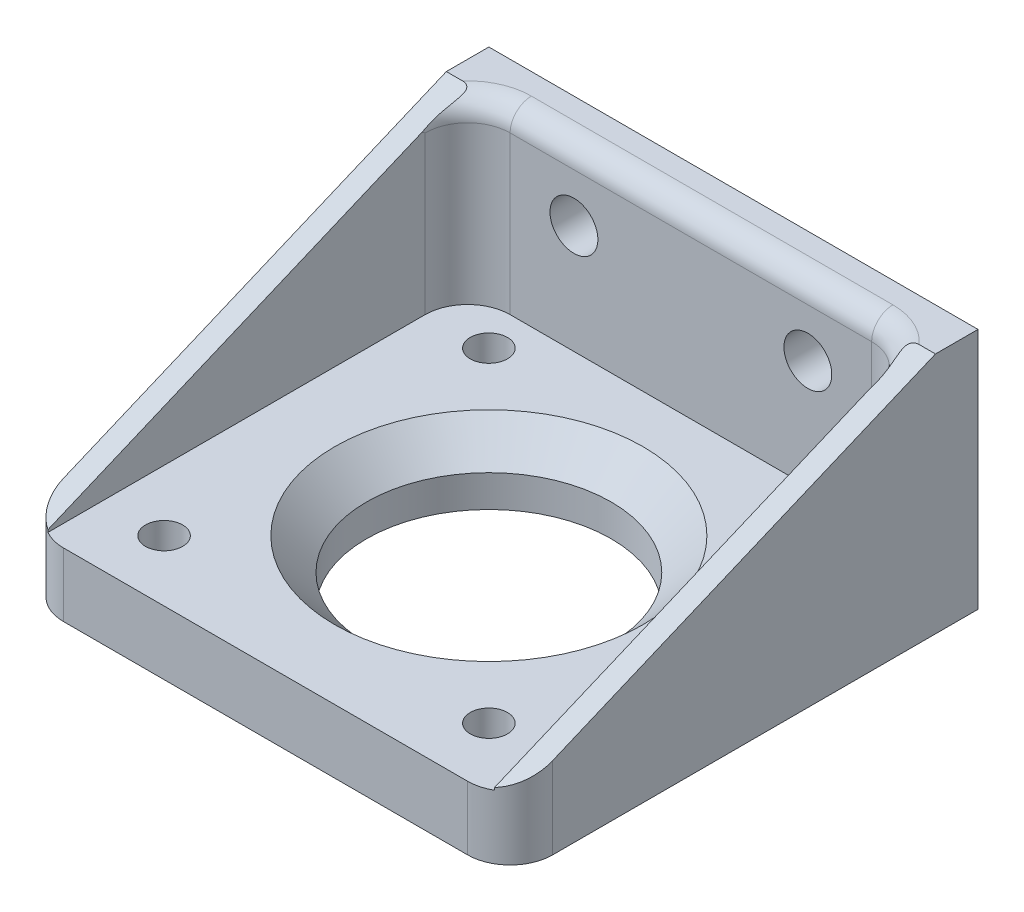
ISO-10303-21;
HEADER;
FILE_DESCRIPTION(('STEP AP214'),'2;1');
FILE_NAME('part.step','',(''),(''),'','','');
FILE_SCHEMA(('AUTOMOTIVE_DESIGN { 1 0 10303 214 1 1 1 1 }'));
ENDSEC;
DATA;
#1=APPLICATION_CONTEXT('core data for automotive mechanical design processes');
#2=APPLICATION_PROTOCOL_DEFINITION('international standard','automotive_design',2000,#1);
#3=PRODUCT_CONTEXT('',#1,'mechanical');
#4=PRODUCT('Part','Part','',(#3));
#5=PRODUCT_RELATED_PRODUCT_CATEGORY('part','',(#4));
#6=PRODUCT_DEFINITION_FORMATION('','',#4);
#7=PRODUCT_DEFINITION_CONTEXT('part definition',#1,'design');
#8=PRODUCT_DEFINITION('design','',#6,#7);
#9=PRODUCT_DEFINITION_SHAPE('','',#8);
#10=(LENGTH_UNIT() NAMED_UNIT(*) SI_UNIT(.MILLI.,.METRE.));
#11=(NAMED_UNIT(*) PLANE_ANGLE_UNIT() SI_UNIT($,.RADIAN.));
#12=(NAMED_UNIT(*) SI_UNIT($,.STERADIAN.) SOLID_ANGLE_UNIT());
#13=UNCERTAINTY_MEASURE_WITH_UNIT(LENGTH_MEASURE(1.E-05),#10,'distance_accuracy_value','');
#14=(GEOMETRIC_REPRESENTATION_CONTEXT(3) GLOBAL_UNCERTAINTY_ASSIGNED_CONTEXT((#13)) GLOBAL_UNIT_ASSIGNED_CONTEXT((#10,
#11,#12)) REPRESENTATION_CONTEXT('',''));
#15=CARTESIAN_POINT('',(0.,0.,0.));
#16=DIRECTION('',(0.,0.,1.));
#17=DIRECTION('',(1.,0.,0.));
#18=AXIS2_PLACEMENT_3D('',#15,#16,#17);
#19=CARTESIAN_POINT('',(0.,3.,0.));
#20=DIRECTION('',(0.,-1.,0.));
#21=DIRECTION('',(0.,0.,-1.));
#22=AXIS2_PLACEMENT_3D('',#19,#20,#21);
#23=PLANE('',#22);
#24=CARTESIAN_POINT('',(-2.,3.,3.64000000000001));
#25=DIRECTION('',(0.,-1.,0.));
#26=DIRECTION('',(0.,0.,-1.));
#27=AXIS2_PLACEMENT_3D('',#24,#25,#26);
#28=CIRCLE('',#27,14.5);
#29=CARTESIAN_POINT('',(-2.,3.,-10.86));
#30=VERTEX_POINT('',#29);
#31=EDGE_CURVE('E11',#30,#30,#28,.T.);
#32=ORIENTED_EDGE('',*,*,#31,.T.);
#33=EDGE_LOOP('',(#32));
#34=FACE_BOUND('',#33,.T.);
#35=CARTESIAN_POINT('',(13.2735064736295,3.,18.9135064736298));
#36=DIRECTION('',(0.,-1.,0.));
#37=DIRECTION('',(0.,0.,-1.));
#38=AXIS2_PLACEMENT_3D('',#35,#36,#37);
#39=CIRCLE('',#38,1.75);
#40=CARTESIAN_POINT('',(13.2735064736295,3.,17.1635064736298));
#41=VERTEX_POINT('',#40);
#42=EDGE_CURVE('E385',#41,#41,#39,.T.);
#43=ORIENTED_EDGE('',*,*,#42,.T.);
#44=EDGE_LOOP('',(#43));
#45=FACE_BOUND('',#44,.T.);
#46=CARTESIAN_POINT('',(13.2735064736297,3.,-11.6335064736291));
#47=DIRECTION('',(0.,-1.,0.));
#48=DIRECTION('',(0.,0.,-1.));
#49=AXIS2_PLACEMENT_3D('',#46,#47,#48);
#50=CIRCLE('',#49,1.75);
#51=CARTESIAN_POINT('',(13.2735064736297,3.,-13.3835064736291));
#52=VERTEX_POINT('',#51);
#53=EDGE_CURVE('E719',#52,#52,#50,.T.);
#54=ORIENTED_EDGE('',*,*,#53,.T.);
#55=EDGE_LOOP('',(#54));
#56=FACE_BOUND('',#55,.T.);
#57=CARTESIAN_POINT('',(-17.2735064736292,3.,-11.6335064736292));
#58=DIRECTION('',(0.,-1.,0.));
#59=DIRECTION('',(0.,0.,-1.));
#60=AXIS2_PLACEMENT_3D('',#57,#58,#59);
#61=CIRCLE('',#60,1.75);
#62=CARTESIAN_POINT('',(-17.2735064736292,3.,-13.3835064736292));
#63=VERTEX_POINT('',#62);
#64=EDGE_CURVE('E717',#63,#63,#61,.T.);
#65=ORIENTED_EDGE('',*,*,#64,.T.);
#66=EDGE_LOOP('',(#65));
#67=FACE_BOUND('',#66,.T.);
#68=CARTESIAN_POINT('',(-17.2735064736294,3.,18.9135064736295));
#69=DIRECTION('',(0.,-1.,0.));
#70=DIRECTION('',(0.,0.,-1.));
#71=AXIS2_PLACEMENT_3D('',#68,#69,#70);
#72=CIRCLE('',#71,1.75);
#73=CARTESIAN_POINT('',(-17.2735064736294,3.,17.1635064736295));
#74=VERTEX_POINT('',#73);
#75=EDGE_CURVE('E714',#74,#74,#72,.T.);
#76=ORIENTED_EDGE('',*,*,#75,.T.);
#77=EDGE_LOOP('',(#76));
#78=FACE_BOUND('',#77,.T.);
#79=DIRECTION('',(0.,0.,1.));
#80=VECTOR('',#79,1.);
#81=CARTESIAN_POINT('',(19.,3.,24.64));
#82=LINE('',#81,#80);
#83=CARTESIAN_POINT('',(19.,3.,-11.36));
#84=VERTEX_POINT('',#83);
#85=CARTESIAN_POINT('',(19.,3.,24.1041016151378));
#86=VERTEX_POINT('',#85);
#87=EDGE_CURVE('E373',#84,#86,#82,.T.);
#88=ORIENTED_EDGE('',*,*,#87,.F.);
#89=CARTESIAN_POINT('',(15.,3.,-11.36));
#90=DIRECTION('',(0.,-1.,0.));
#91=DIRECTION('',(0.,0.,-1.));
#92=AXIS2_PLACEMENT_3D('',#89,#90,#91);
#93=CIRCLE('',#92,4.);
#94=CARTESIAN_POINT('',(15.,3.,-15.36));
#95=VERTEX_POINT('',#94);
#96=EDGE_CURVE('E226',#84,#95,#93,.F.);
#97=ORIENTED_EDGE('',*,*,#96,.T.);
#98=DIRECTION('',(1.,0.,0.));
#99=VECTOR('',#98,1.);
#100=CARTESIAN_POINT('',(-25.,3.,-15.36));
#101=LINE('',#100,#99);
#102=CARTESIAN_POINT('',(-19.,3.,-15.36));
#103=VERTEX_POINT('',#102);
#104=EDGE_CURVE('E187',#103,#95,#101,.T.);
#105=ORIENTED_EDGE('',*,*,#104,.F.);
#106=CARTESIAN_POINT('',(-19.,3.,-11.36));
#107=DIRECTION('',(0.,-1.,0.));
#108=DIRECTION('',(0.,0.,-1.));
#109=AXIS2_PLACEMENT_3D('',#106,#107,#108);
#110=CIRCLE('',#109,4.);
#111=CARTESIAN_POINT('',(-23.,3.,-11.36));
#112=VERTEX_POINT('',#111);
#113=EDGE_CURVE('E224',#103,#112,#110,.F.);
#114=ORIENTED_EDGE('',*,*,#113,.T.);
#115=DIRECTION('',(0.,0.,1.));
#116=VECTOR('',#115,1.);
#117=CARTESIAN_POINT('',(-23.,3.,-15.36));
#118=LINE('',#117,#116);
#119=CARTESIAN_POINT('',(-23.,3.,24.1041016151378));
#120=VERTEX_POINT('',#119);
#121=EDGE_CURVE('E190',#112,#120,#118,.T.);
#122=ORIENTED_EDGE('',*,*,#121,.T.);
#123=CARTESIAN_POINT('',(-21.,3.,20.64));
#124=DIRECTION('',(0.,-1.,0.));
#125=DIRECTION('',(0.,0.,-1.));
#126=AXIS2_PLACEMENT_3D('',#123,#124,#125);
#127=CIRCLE('',#126,4.);
#128=CARTESIAN_POINT('',(-21.,3.,24.64));
#129=VERTEX_POINT('',#128);
#130=EDGE_CURVE('E220',#120,#129,#127,.F.);
#131=ORIENTED_EDGE('',*,*,#130,.T.);
#132=DIRECTION('',(1.,0.,0.));
#133=VECTOR('',#132,1.);
#134=CARTESIAN_POINT('',(-25.,3.,24.64));
#135=LINE('',#134,#133);
#136=CARTESIAN_POINT('',(17.,3.,24.64));
#137=VERTEX_POINT('',#136);
#138=EDGE_CURVE('E200',#129,#137,#135,.T.);
#139=ORIENTED_EDGE('',*,*,#138,.T.);
#140=CARTESIAN_POINT('',(17.,3.,20.64));
#141=DIRECTION('',(0.,-1.,0.));
#142=DIRECTION('',(0.,0.,-1.));
#143=AXIS2_PLACEMENT_3D('',#140,#141,#142);
#144=CIRCLE('',#143,4.);
#145=EDGE_CURVE('E222',#137,#86,#144,.F.);
#146=ORIENTED_EDGE('',*,*,#145,.T.);
#147=EDGE_LOOP('',(#88,#97,#105,#114,#122,#131,#139,#146));
#148=FACE_BOUND('',#147,.T.);
#149=ADVANCED_FACE('F41',(#34,#45,#56,#67,#78,#148),#23,.F.);
#150=CARTESIAN_POINT('',(-25.,19.8,-15.36));
#151=DIRECTION('',(0.,0.,-1.));
#152=DIRECTION('',(-1.,0.,0.));
#153=AXIS2_PLACEMENT_3D('',#150,#151,#152);
#154=PLANE('',#153);
#155=CARTESIAN_POINT('',(9.,13.2389047699533,-15.36));
#156=DIRECTION('',(0.,0.,-1.));
#157=DIRECTION('',(-1.,0.,0.));
#158=AXIS2_PLACEMENT_3D('',#155,#156,#157);
#159=CIRCLE('',#158,2.25);
#160=CARTESIAN_POINT('',(6.75,13.2389047699533,-15.36));
#161=VERTEX_POINT('',#160);
#162=EDGE_CURVE('E695',#161,#161,#159,.T.);
#163=ORIENTED_EDGE('',*,*,#162,.T.);
#164=EDGE_LOOP('',(#163));
#165=FACE_BOUND('',#164,.T.);
#166=CARTESIAN_POINT('',(-13.,13.2389047699533,-15.36));
#167=DIRECTION('',(0.,0.,-1.));
#168=DIRECTION('',(-1.,0.,0.));
#169=AXIS2_PLACEMENT_3D('',#166,#167,#168);
#170=CIRCLE('',#169,2.25);
#171=CARTESIAN_POINT('',(-15.25,13.2389047699533,-15.36));
#172=VERTEX_POINT('',#171);
#173=EDGE_CURVE('E697',#172,#172,#170,.T.);
#174=ORIENTED_EDGE('',*,*,#173,.T.);
#175=EDGE_LOOP('',(#174));
#176=FACE_BOUND('',#175,.T.);
#177=DIRECTION('',(0.,-1.,0.));
#178=VECTOR('',#177,1.);
#179=CARTESIAN_POINT('',(15.,19.8,-15.36));
#180=LINE('',#179,#178);
#181=CARTESIAN_POINT('',(15.,17.8,-15.36));
#182=VERTEX_POINT('',#181);
#183=EDGE_CURVE('E230',#95,#182,#180,.F.);
#184=ORIENTED_EDGE('',*,*,#183,.T.);
#185=DIRECTION('',(1.,0.,0.));
#186=VECTOR('',#185,1.);
#187=CARTESIAN_POINT('',(-19.,17.8,-15.36));
#188=LINE('',#187,#186);
#189=CARTESIAN_POINT('',(-19.,17.8,-15.36));
#190=VERTEX_POINT('',#189);
#191=EDGE_CURVE('E414',#182,#190,#188,.F.);
#192=ORIENTED_EDGE('',*,*,#191,.T.);
#193=DIRECTION('',(0.,-1.,0.));
#194=VECTOR('',#193,1.);
#195=CARTESIAN_POINT('',(-19.,3.,-15.36));
#196=LINE('',#195,#194);
#197=EDGE_CURVE('E228',#190,#103,#196,.T.);
#198=ORIENTED_EDGE('',*,*,#197,.T.);
#199=ORIENTED_EDGE('',*,*,#104,.T.);
#200=EDGE_LOOP('',(#184,#192,#198,#199));
#201=FACE_BOUND('',#200,.T.);
#202=ADVANCED_FACE('F322',(#165,#176,#201),#154,.F.);
#203=CARTESIAN_POINT('',(0.,-3.,0.));
#204=DIRECTION('',(0.,-1.,0.));
#205=DIRECTION('',(0.,0.,-1.));
#206=AXIS2_PLACEMENT_3D('',#203,#204,#205);
#207=PLANE('',#206);
#208=CARTESIAN_POINT('',(13.2735064736295,-3.,18.9135064736298));
#209=DIRECTION('',(0.,-1.,0.));
#210=DIRECTION('',(0.,0.,-1.));
#211=AXIS2_PLACEMENT_3D('',#208,#209,#210);
#212=CIRCLE('',#211,1.75);
#213=CARTESIAN_POINT('',(13.2735064736295,-3.,17.1635064736298));
#214=VERTEX_POINT('',#213);
#215=EDGE_CURVE('E696',#214,#214,#212,.T.);
#216=ORIENTED_EDGE('',*,*,#215,.F.);
#217=EDGE_LOOP('',(#216));
#218=FACE_BOUND('',#217,.T.);
#219=CARTESIAN_POINT('',(13.2735064736297,-3.,-11.6335064736291));
#220=DIRECTION('',(0.,-1.,0.));
#221=DIRECTION('',(0.,0.,-1.));
#222=AXIS2_PLACEMENT_3D('',#219,#220,#221);
#223=CIRCLE('',#222,1.75);
#224=CARTESIAN_POINT('',(13.2735064736297,-3.,-13.3835064736291));
#225=VERTEX_POINT('',#224);
#226=EDGE_CURVE('E700',#225,#225,#223,.T.);
#227=ORIENTED_EDGE('',*,*,#226,.F.);
#228=EDGE_LOOP('',(#227));
#229=FACE_BOUND('',#228,.T.);
#230=CARTESIAN_POINT('',(-17.2735064736292,-3.,-11.6335064736292));
#231=DIRECTION('',(0.,-1.,0.));
#232=DIRECTION('',(0.,0.,-1.));
#233=AXIS2_PLACEMENT_3D('',#230,#231,#232);
#234=CIRCLE('',#233,1.75);
#235=CARTESIAN_POINT('',(-17.2735064736292,-3.,-13.3835064736292));
#236=VERTEX_POINT('',#235);
#237=EDGE_CURVE('E706',#236,#236,#234,.T.);
#238=ORIENTED_EDGE('',*,*,#237,.F.);
#239=EDGE_LOOP('',(#238));
#240=FACE_BOUND('',#239,.T.);
#241=CARTESIAN_POINT('',(-17.2735064736294,-3.,18.9135064736295));
#242=DIRECTION('',(0.,-1.,0.));
#243=DIRECTION('',(0.,0.,-1.));
#244=AXIS2_PLACEMENT_3D('',#241,#242,#243);
#245=CIRCLE('',#244,1.75);
#246=CARTESIAN_POINT('',(-17.2735064736294,-3.,17.1635064736295));
#247=VERTEX_POINT('',#246);
#248=EDGE_CURVE('E709',#247,#247,#245,.T.);
#249=ORIENTED_EDGE('',*,*,#248,.F.);
#250=EDGE_LOOP('',(#249));
#251=FACE_BOUND('',#250,.T.);
#252=DIRECTION('',(0.,0.,-1.));
#253=VECTOR('',#252,1.);
#254=CARTESIAN_POINT('',(21.,-3.,24.64));
#255=LINE('',#254,#253);
#256=CARTESIAN_POINT('',(21.,-3.,20.64));
#257=VERTEX_POINT('',#256);
#258=CARTESIAN_POINT('',(21.,-3.,-19.36));
#259=VERTEX_POINT('',#258);
#260=EDGE_CURVE('E199',#257,#259,#255,.T.);
#261=ORIENTED_EDGE('',*,*,#260,.F.);
#262=CARTESIAN_POINT('',(17.,-3.,20.64));
#263=DIRECTION('',(0.,-1.,0.));
#264=DIRECTION('',(0.,0.,-1.));
#265=AXIS2_PLACEMENT_3D('',#262,#263,#264);
#266=CIRCLE('',#265,4.);
#267=CARTESIAN_POINT('',(17.,-3.,24.64));
#268=VERTEX_POINT('',#267);
#269=EDGE_CURVE('E242',#257,#268,#266,.T.);
#270=ORIENTED_EDGE('',*,*,#269,.T.);
#271=DIRECTION('',(1.,0.,0.));
#272=VECTOR('',#271,1.);
#273=CARTESIAN_POINT('',(-25.,-3.,24.64));
#274=LINE('',#273,#272);
#275=CARTESIAN_POINT('',(-21.,-3.,24.64));
#276=VERTEX_POINT('',#275);
#277=EDGE_CURVE('E204',#276,#268,#274,.T.);
#278=ORIENTED_EDGE('',*,*,#277,.F.);
#279=CARTESIAN_POINT('',(-21.,-3.,20.64));
#280=DIRECTION('',(0.,-1.,0.));
#281=DIRECTION('',(0.,0.,-1.));
#282=AXIS2_PLACEMENT_3D('',#279,#280,#281);
#283=CIRCLE('',#282,4.);
#284=CARTESIAN_POINT('',(-25.,-3.,20.64));
#285=VERTEX_POINT('',#284);
#286=EDGE_CURVE('E240',#276,#285,#283,.T.);
#287=ORIENTED_EDGE('',*,*,#286,.T.);
#288=DIRECTION('',(0.,0.,1.));
#289=VECTOR('',#288,1.);
#290=CARTESIAN_POINT('',(-25.,-3.,24.64));
#291=LINE('',#290,#289);
#292=CARTESIAN_POINT('',(-25.,-3.,-19.36));
#293=VERTEX_POINT('',#292);
#294=EDGE_CURVE('E208',#293,#285,#291,.T.);
#295=ORIENTED_EDGE('',*,*,#294,.F.);
#296=DIRECTION('',(-1.,0.,0.));
#297=VECTOR('',#296,1.);
#298=CARTESIAN_POINT('',(-25.,-3.,-19.36));
#299=LINE('',#298,#297);
#300=EDGE_CURVE('E206',#259,#293,#299,.T.);
#301=ORIENTED_EDGE('',*,*,#300,.F.);
#302=EDGE_LOOP('',(#261,#270,#278,#287,#295,#301));
#303=FACE_BOUND('',#302,.T.);
#304=CARTESIAN_POINT('',(-2.,-3.,3.64000000000001));
#305=DIRECTION('',(0.,1.,0.));
#306=DIRECTION('',(0.,0.,1.));
#307=AXIS2_PLACEMENT_3D('',#304,#305,#306);
#308=CIRCLE('',#307,11.5);
#309=CARTESIAN_POINT('',(-2.,-3.,15.14));
#310=VERTEX_POINT('',#309);
#311=EDGE_CURVE('E195',#310,#310,#308,.T.);
#312=ORIENTED_EDGE('',*,*,#311,.T.);
#313=EDGE_LOOP('',(#312));
#314=FACE_BOUND('',#313,.T.);
#315=ADVANCED_FACE('F328',(#218,#229,#240,#251,#303,#314),#207,.T.);
#316=CARTESIAN_POINT('',(21.,3.,24.64));
#317=DIRECTION('',(-1.,0.,0.));
#318=DIRECTION('',(0.,0.,1.));
#319=AXIS2_PLACEMENT_3D('',#316,#317,#318);
#320=PLANE('',#319);
#321=DIRECTION('',(0.,0.387232484355092,-0.921982105607361));
#322=VECTOR('',#321,1.);
#323=CARTESIAN_POINT('',(21.,3.,24.64));
#324=LINE('',#323,#322);
#325=CARTESIAN_POINT('',(21.,4.68,20.64));
#326=VERTEX_POINT('',#325);
#327=CARTESIAN_POINT('',(21.,19.8,-15.36));
#328=VERTEX_POINT('',#327);
#329=EDGE_CURVE('E381',#326,#328,#324,.T.);
#330=ORIENTED_EDGE('',*,*,#329,.F.);
#331=DIRECTION('',(0.,-1.,0.));
#332=VECTOR('',#331,1.);
#333=CARTESIAN_POINT('',(21.,3.,20.64));
#334=LINE('',#333,#332);
#335=EDGE_CURVE('E237',#326,#257,#334,.T.);
#336=ORIENTED_EDGE('',*,*,#335,.T.);
#337=ORIENTED_EDGE('',*,*,#260,.T.);
#338=DIRECTION('',(0.,-1.,0.));
#339=VECTOR('',#338,1.);
#340=CARTESIAN_POINT('',(21.,3.,-19.36));
#341=LINE('',#340,#339);
#342=CARTESIAN_POINT('',(21.,19.8,-19.36));
#343=VERTEX_POINT('',#342);
#344=EDGE_CURVE('E213',#343,#259,#341,.T.);
#345=ORIENTED_EDGE('',*,*,#344,.F.);
#346=DIRECTION('',(0.,0.,-1.));
#347=VECTOR('',#346,1.);
#348=CARTESIAN_POINT('',(21.,19.8,-19.36));
#349=LINE('',#348,#347);
#350=EDGE_CURVE('E180',#328,#343,#349,.T.);
#351=ORIENTED_EDGE('',*,*,#350,.F.);
#352=EDGE_LOOP('',(#330,#336,#337,#345,#351));
#353=FACE_BOUND('',#352,.T.);
#354=ADVANCED_FACE('F337',(#353),#320,.F.);
#355=CARTESIAN_POINT('',(-25.,3.,-19.36));
#356=DIRECTION('',(0.,0.,1.));
#357=DIRECTION('',(1.,0.,0.));
#358=AXIS2_PLACEMENT_3D('',#355,#356,#357);
#359=PLANE('',#358);
#360=CARTESIAN_POINT('',(9.,13.2389047699533,-19.36));
#361=DIRECTION('',(0.,0.,-1.));
#362=DIRECTION('',(-1.,0.,0.));
#363=AXIS2_PLACEMENT_3D('',#360,#361,#362);
#364=CIRCLE('',#363,2.25);
#365=CARTESIAN_POINT('',(6.75,13.2389047699533,-19.36));
#366=VERTEX_POINT('',#365);
#367=EDGE_CURVE('E692',#366,#366,#364,.T.);
#368=ORIENTED_EDGE('',*,*,#367,.F.);
#369=EDGE_LOOP('',(#368));
#370=FACE_BOUND('',#369,.T.);
#371=CARTESIAN_POINT('',(-13.,13.2389047699533,-19.36));
#372=DIRECTION('',(0.,0.,-1.));
#373=DIRECTION('',(-1.,0.,0.));
#374=AXIS2_PLACEMENT_3D('',#371,#372,#373);
#375=CIRCLE('',#374,2.25);
#376=CARTESIAN_POINT('',(-15.25,13.2389047699533,-19.36));
#377=VERTEX_POINT('',#376);
#378=EDGE_CURVE('E422',#377,#377,#375,.T.);
#379=ORIENTED_EDGE('',*,*,#378,.F.);
#380=EDGE_LOOP('',(#379));
#381=FACE_BOUND('',#380,.T.);
#382=ORIENTED_EDGE('',*,*,#300,.T.);
#383=DIRECTION('',(0.,-1.,0.));
#384=VECTOR('',#383,1.);
#385=CARTESIAN_POINT('',(-25.,3.,-19.36));
#386=LINE('',#385,#384);
#387=CARTESIAN_POINT('',(-25.,19.8,-19.36));
#388=VERTEX_POINT('',#387);
#389=EDGE_CURVE('E203',#388,#293,#386,.T.);
#390=ORIENTED_EDGE('',*,*,#389,.F.);
#391=DIRECTION('',(-1.,0.,0.));
#392=VECTOR('',#391,1.);
#393=CARTESIAN_POINT('',(-25.,19.8,-19.36));
#394=LINE('',#393,#392);
#395=EDGE_CURVE('E186',#343,#388,#394,.T.);
#396=ORIENTED_EDGE('',*,*,#395,.F.);
#397=ORIENTED_EDGE('',*,*,#344,.T.);
#398=EDGE_LOOP('',(#382,#390,#396,#397));
#399=FACE_BOUND('',#398,.T.);
#400=ADVANCED_FACE('F345',(#370,#381,#399),#359,.F.);
#401=CARTESIAN_POINT('',(-25.,3.,24.64));
#402=DIRECTION('',(1.,0.,0.));
#403=DIRECTION('',(0.,0.,-1.));
#404=AXIS2_PLACEMENT_3D('',#401,#402,#403);
#405=PLANE('',#404);
#406=ORIENTED_EDGE('',*,*,#294,.T.);
#407=DIRECTION('',(0.,-1.,0.));
#408=VECTOR('',#407,1.);
#409=CARTESIAN_POINT('',(-25.,3.,20.64));
#410=LINE('',#409,#408);
#411=CARTESIAN_POINT('',(-25.,4.68,20.64));
#412=VERTEX_POINT('',#411);
#413=EDGE_CURVE('E166',#285,#412,#410,.F.);
#414=ORIENTED_EDGE('',*,*,#413,.T.);
#415=DIRECTION('',(0.,0.387232484355092,-0.921982105607361));
#416=VECTOR('',#415,1.);
#417=CARTESIAN_POINT('',(-25.,3.,24.64));
#418=LINE('',#417,#416);
#419=CARTESIAN_POINT('',(-25.,19.8,-15.36));
#420=VERTEX_POINT('',#419);
#421=EDGE_CURVE('E158',#412,#420,#418,.T.);
#422=ORIENTED_EDGE('',*,*,#421,.T.);
#423=DIRECTION('',(0.,0.,1.));
#424=VECTOR('',#423,1.);
#425=CARTESIAN_POINT('',(-25.,19.8,-19.36));
#426=LINE('',#425,#424);
#427=EDGE_CURVE('E164',#388,#420,#426,.T.);
#428=ORIENTED_EDGE('',*,*,#427,.F.);
#429=ORIENTED_EDGE('',*,*,#389,.T.);
#430=EDGE_LOOP('',(#406,#414,#422,#428,#429));
#431=FACE_BOUND('',#430,.T.);
#432=ADVANCED_FACE('F161',(#431),#405,.F.);
#433=CARTESIAN_POINT('',(-25.,3.,24.64));
#434=DIRECTION('',(0.,0.,-1.));
#435=DIRECTION('',(-1.,0.,0.));
#436=AXIS2_PLACEMENT_3D('',#433,#434,#435);
#437=PLANE('',#436);
#438=ORIENTED_EDGE('',*,*,#277,.T.);
#439=DIRECTION('',(0.,-1.,0.));
#440=VECTOR('',#439,1.);
#441=CARTESIAN_POINT('',(17.,3.,24.64));
#442=LINE('',#441,#440);
#443=EDGE_CURVE('E247',#268,#137,#442,.F.);
#444=ORIENTED_EDGE('',*,*,#443,.T.);
#445=ORIENTED_EDGE('',*,*,#138,.F.);
#446=DIRECTION('',(0.,-1.,0.));
#447=VECTOR('',#446,1.);
#448=CARTESIAN_POINT('',(-21.,3.,24.64));
#449=LINE('',#448,#447);
#450=EDGE_CURVE('E244',#129,#276,#449,.T.);
#451=ORIENTED_EDGE('',*,*,#450,.T.);
#452=EDGE_LOOP('',(#438,#444,#445,#451));
#453=FACE_BOUND('',#452,.T.);
#454=ADVANCED_FACE('F339',(#453),#437,.F.);
#455=CARTESIAN_POINT('',(-2.,3.,3.64000000000001));
#456=DIRECTION('',(0.,-1.,0.));
#457=DIRECTION('',(0.,0.,-1.));
#458=AXIS2_PLACEMENT_3D('',#455,#456,#457);
#459=CYLINDRICAL_SURFACE('',#458,11.5);
#460=CARTESIAN_POINT('',(-2.,0.,3.64000000000001));
#461=DIRECTION('',(0.,-1.,0.));
#462=DIRECTION('',(0.,0.,-1.));
#463=AXIS2_PLACEMENT_3D('',#460,#461,#462);
#464=CIRCLE('',#463,11.5);
#465=CARTESIAN_POINT('',(-2.,0.,-7.85999999999999));
#466=VERTEX_POINT('',#465);
#467=EDGE_CURVE('E50',#466,#466,#464,.F.);
#468=ORIENTED_EDGE('',*,*,#467,.T.);
#469=EDGE_LOOP('',(#468));
#470=FACE_BOUND('',#469,.T.);
#471=ORIENTED_EDGE('',*,*,#311,.F.);
#472=EDGE_LOOP('',(#471));
#473=FACE_BOUND('',#472,.T.);
#474=ADVANCED_FACE('F334',(#470,#473),#459,.F.);
#475=CARTESIAN_POINT('',(0.,19.8,0.));
#476=DIRECTION('',(0.,1.,0.));
#477=DIRECTION('',(0.,0.,1.));
#478=AXIS2_PLACEMENT_3D('',#475,#476,#477);
#479=PLANE('',#478);
#480=DIRECTION('',(1.,0.,0.));
#481=VECTOR('',#480,1.);
#482=CARTESIAN_POINT('',(-25.,19.8,-15.36));
#483=LINE('',#482,#481);
#484=CARTESIAN_POINT('',(-23.4721359549996,19.8,-15.36));
#485=VERTEX_POINT('',#484);
#486=EDGE_CURVE('E173',#420,#485,#483,.T.);
#487=ORIENTED_EDGE('',*,*,#486,.T.);
#488=CARTESIAN_POINT('',(-19.,19.8,-11.36));
#489=DIRECTION('',(0.,1.,0.));
#490=DIRECTION('',(0.,0.,1.));
#491=AXIS2_PLACEMENT_3D('',#488,#489,#490);
#492=CIRCLE('',#491,6.);
#493=CARTESIAN_POINT('',(-19.,19.8,-17.36));
#494=VERTEX_POINT('',#493);
#495=EDGE_CURVE('E258',#485,#494,#492,.F.);
#496=ORIENTED_EDGE('',*,*,#495,.T.);
#497=DIRECTION('',(1.,0.,0.));
#498=VECTOR('',#497,1.);
#499=CARTESIAN_POINT('',(15.,19.8,-17.36));
#500=LINE('',#499,#498);
#501=CARTESIAN_POINT('',(15.,19.8,-17.36));
#502=VERTEX_POINT('',#501);
#503=EDGE_CURVE('E256',#494,#502,#500,.T.);
#504=ORIENTED_EDGE('',*,*,#503,.T.);
#505=CARTESIAN_POINT('',(15.,19.8,-11.36));
#506=DIRECTION('',(0.,1.,0.));
#507=DIRECTION('',(0.,0.,1.));
#508=AXIS2_PLACEMENT_3D('',#505,#506,#507);
#509=CIRCLE('',#508,6.);
#510=CARTESIAN_POINT('',(19.4721359549996,19.8,-15.36));
#511=VERTEX_POINT('',#510);
#512=EDGE_CURVE('E254',#502,#511,#509,.F.);
#513=ORIENTED_EDGE('',*,*,#512,.T.);
#514=DIRECTION('',(1.,0.,0.));
#515=VECTOR('',#514,1.);
#516=CARTESIAN_POINT('',(19.,19.8,-15.36));
#517=LINE('',#516,#515);
#518=EDGE_CURVE('E170',#511,#328,#517,.T.);
#519=ORIENTED_EDGE('',*,*,#518,.T.);
#520=ORIENTED_EDGE('',*,*,#350,.T.);
#521=ORIENTED_EDGE('',*,*,#395,.T.);
#522=ORIENTED_EDGE('',*,*,#427,.T.);
#523=EDGE_LOOP('',(#487,#496,#504,#513,#519,#520,#521,#522));
#524=FACE_BOUND('',#523,.T.);
#525=ADVANCED_FACE('F183',(#524),#479,.T.);
#526=CARTESIAN_POINT('',(-23.,3.,24.64));
#527=DIRECTION('',(0.,0.921982105607361,0.387232484355092));
#528=DIRECTION('',(0.,-0.387232484355092,0.921982105607361));
#529=AXIS2_PLACEMENT_3D('',#526,#527,#528);
#530=PLANE('',#529);
#531=DIRECTION('',(0.,0.387232484355092,-0.921982105607361));
#532=VECTOR('',#531,1.);
#533=CARTESIAN_POINT('',(-23.,3.,24.64));
#534=LINE('',#533,#532);
#535=CARTESIAN_POINT('',(-23.,3.22507732164214,24.1041016151378));
#536=VERTEX_POINT('',#535);
#537=CARTESIAN_POINT('',(-23.,18.0006150284118,-11.0757500676471));
#538=VERTEX_POINT('',#537);
#539=EDGE_CURVE('E169',#536,#538,#534,.T.);
#540=ORIENTED_EDGE('',*,*,#539,.T.);
#541=CARTESIAN_POINT('',(-23.,18.0006150284118,-11.0757500676471));
#542=CARTESIAN_POINT('',(-23.0126873197146,18.0475130252187,-11.1874119648065));
#543=CARTESIAN_POINT('',(-23.0223344588837,18.094529171564,-11.2993551703905));
#544=CARTESIAN_POINT('',(-23.0357862334119,18.1886707999268,-11.5235019045875));
#545=CARTESIAN_POINT('',(-23.0395929258982,18.2357962375896,-11.6357053275941));
#546=CARTESIAN_POINT('',(-23.0416047419086,18.3298046152374,-11.8595347981843));
#547=CARTESIAN_POINT('',(-23.0398404217505,18.3766874701925,-11.9711606433155));
#548=CARTESIAN_POINT('',(-23.0311206982482,18.4703822781451,-12.1942435193932));
#549=CARTESIAN_POINT('',(-23.0241649080875,18.5171942255989,-12.3057005371402));
#550=CARTESIAN_POINT('',(-23.0056875968255,18.6098372037759,-12.5262790566094));
#551=CARTESIAN_POINT('',(-22.9942500230372,18.6556707950437,-12.6354066548658));
#552=CARTESIAN_POINT('',(-22.9674028194854,18.7471639802359,-12.8532475719903));
#553=CARTESIAN_POINT('',(-22.9519928710062,18.7928235599006,-12.9619608569062));
#554=CARTESIAN_POINT('',(-22.9180230805476,18.8840053310033,-13.1790603119125));
#555=CARTESIAN_POINT('',(-22.8994604011387,18.9295273607511,-13.2874460970264));
#556=CARTESIAN_POINT('',(-22.8604125769851,19.0204457563549,-13.5039184675116));
#557=CARTESIAN_POINT('',(-22.8399273735832,19.0658421183331,-13.6120050436502));
#558=CARTESIAN_POINT('',(-22.8115260572747,19.1288950248425,-13.7621310115296));
#559=CARTESIAN_POINT('',(-22.8035793157853,19.1465497800507,-13.8041661429779));
#560=CARTESIAN_POINT('',(-22.7878813685466,19.1818695766775,-13.8882608968512));
#561=CARTESIAN_POINT('',(-22.7801301321017,19.1995346160301,-13.9303205143573));
#562=CARTESIAN_POINT('',(-22.7574349314295,19.2526359915066,-14.0567523607299));
#563=CARTESIAN_POINT('',(-22.7430816570046,19.2881105660202,-14.1412156333815));
#564=CARTESIAN_POINT('',(-22.7192871742502,19.3568387833111,-14.3048542459788));
#565=CARTESIAN_POINT('',(-22.7095750819,19.3900765132353,-14.3839916981793));
#566=CARTESIAN_POINT('',(-22.7004995509405,19.4400721927598,-14.5030290303805));
#567=CARTESIAN_POINT('',(-22.6983894013092,19.4567497585564,-14.5427375203724));
#568=CARTESIAN_POINT('',(-22.6967725707366,19.4901199820443,-14.6221904334388));
#569=CARTESIAN_POINT('',(-22.6972642208225,19.5068126231949,-14.6619348171308));
#570=CARTESIAN_POINT('',(-22.7019273606395,19.5405655446558,-14.7422989158471));
#571=CARTESIAN_POINT('',(-22.7061935390535,19.5576241884811,-14.7829147344788));
#572=CARTESIAN_POINT('',(-22.7200498025536,19.591431520547,-14.8634083822547));
#573=CARTESIAN_POINT('',(-22.72963445828,19.6081805069125,-14.9032869212203));
#574=CARTESIAN_POINT('',(-22.7532452559898,19.6375408796488,-14.9731925705925));
#575=CARTESIAN_POINT('',(-22.7659789750384,19.6503033197004,-15.00357933262));
#576=CARTESIAN_POINT('',(-22.796696273642,19.6748431434605,-15.0620074844298));
#577=CARTESIAN_POINT('',(-22.8146711312155,19.6866221222285,-15.0900526719726));
#578=CARTESIAN_POINT('',(-22.8561798178339,19.7087727057339,-15.1427921565093));
#579=CARTESIAN_POINT('',(-22.8797581495139,19.7191319391496,-15.1674569979751));
#580=CARTESIAN_POINT('',(-22.9316001581271,19.7379032397533,-15.2121505708412));
#581=CARTESIAN_POINT('',(-22.9598648689264,19.746314876297,-15.2321782768976));
#582=CARTESIAN_POINT('',(-23.0227112793246,19.7618131928217,-15.2690790305277));
#583=CARTESIAN_POINT('',(-23.0576416808475,19.7686848088907,-15.2854400211684));
#584=CARTESIAN_POINT('',(-23.1300240239824,19.780173785701,-15.3127947278594));
#585=CARTESIAN_POINT('',(-23.1674879543777,19.7847794307745,-15.323760549463));
#586=CARTESIAN_POINT('',(-23.2493763446588,19.7926012310057,-15.3423838833468));
#587=CARTESIAN_POINT('',(-23.2939936009326,19.7955000033796,-15.3492857223323));
#588=CARTESIAN_POINT('',(-23.383181478133,19.7991751081381,-15.3580359717574));
#589=CARTESIAN_POINT('',(-23.4277434951878,19.7999814413771,-15.3599558128027));
#590=CARTESIAN_POINT('',(-23.4721359549996,19.8,-15.36));
#591=B_SPLINE_CURVE_WITH_KNOTS('',3,(#541,#542,#543,#544,#545,#546,#547,#548,#549,#550,#551,
#552,#553,#554,#555,#556,#557,#558,#559,#560,#561,#562,#563,#564,#565,#566,#567,#568,#569,#570,
#571,#572,#573,#574,#575,#576,#577,#578,#579,#580,#581,#582,#583,#584,#585,#586,#587,#588,#589,
#590),.UNSPECIFIED.,.F.,.F.,(4,2,2,2,2,2,2,2,2,2,2,2,2,2,2,2,2,2,2,2,2,2,2,2,4),(0.,
0.365262865467628,0.730397048173598,1.09353200068371,1.45669401308449,1.8133560270438,
2.17004666599997,2.52706004109186,2.88408431238544,3.02292296220104,3.16173967603257,
3.43990877090862,3.69885691214443,3.82816367176883,3.95738749523008,4.08994798364448,
4.22237339617908,4.32798280302259,4.43341745454823,4.53971922805994,4.64604448417723,
4.76294745203633,4.88044864853444,5.0158004006328,5.14920051124709),.UNSPECIFIED.);
#592=EDGE_CURVE('E176',#538,#485,#591,.T.);
#593=ORIENTED_EDGE('',*,*,#592,.T.);
#594=ORIENTED_EDGE('',*,*,#486,.F.);
#595=ORIENTED_EDGE('',*,*,#421,.F.);
#596=CARTESIAN_POINT('',(-21.,4.68,20.64));
#597=DIRECTION('',(0.,0.921982105607361,0.387232484355092));
#598=DIRECTION('',(0.,-0.387232484355092,0.921982105607361));
#599=AXIS2_PLACEMENT_3D('',#596,#597,#598);
#600=ELLIPSE('',#599,4.338478996146,4.);
#601=EDGE_CURVE('E252',#412,#536,#600,.T.);
#602=ORIENTED_EDGE('',*,*,#601,.T.);
#603=EDGE_LOOP('',(#540,#593,#594,#595,#602));
#604=FACE_BOUND('',#603,.T.);
#605=ADVANCED_FACE('F174',(#604),#530,.T.);
#606=CARTESIAN_POINT('',(-23.,0.,0.));
#607=DIRECTION('',(-1.,0.,0.));
#608=DIRECTION('',(0.,0.,1.));
#609=AXIS2_PLACEMENT_3D('',#606,#607,#608);
#610=PLANE('',#609);
#611=DIRECTION('',(0.,-1.,0.));
#612=VECTOR('',#611,1.);
#613=CARTESIAN_POINT('',(-23.,19.8,-11.36));
#614=LINE('',#613,#612);
#615=CARTESIAN_POINT('',(-23.,17.8,-11.36));
#616=VERTEX_POINT('',#615);
#617=EDGE_CURVE('E235',#112,#616,#614,.F.);
#618=ORIENTED_EDGE('',*,*,#617,.T.);
#619=CARTESIAN_POINT('',(-23.,18.0006150284118,-11.0757500676471));
#620=CARTESIAN_POINT('',(-23.,17.9362589697169,-11.1671148209728));
#621=CARTESIAN_POINT('',(-23.,17.8718216120002,-11.2584221436915));
#622=CARTESIAN_POINT('',(-23.,17.8048687525663,-11.3531147722852));
#623=CARTESIAN_POINT('',(-23.,17.8024344341458,-11.3565574270175));
#624=CARTESIAN_POINT('',(-23.,17.8,-11.36));
#625=B_SPLINE_CURVE_WITH_KNOTS('',3,(#619,#620,#621,#622,#623,#624),.UNSPECIFIED.,.F.,.F.,(4,2,
4),(0.,0.335265271485465,0.347914382126148),.UNSPECIFIED.);
#626=EDGE_CURVE('E57',#616,#538,#625,.F.);
#627=ORIENTED_EDGE('',*,*,#626,.T.);
#628=ORIENTED_EDGE('',*,*,#539,.F.);
#629=DIRECTION('',(0.,-1.,0.));
#630=VECTOR('',#629,1.);
#631=CARTESIAN_POINT('',(-23.,3.22507732164214,24.1041016151378));
#632=LINE('',#631,#630);
#633=EDGE_CURVE('E233',#536,#120,#632,.T.);
#634=ORIENTED_EDGE('',*,*,#633,.T.);
#635=ORIENTED_EDGE('',*,*,#121,.F.);
#636=EDGE_LOOP('',(#618,#627,#628,#634,#635));
#637=FACE_BOUND('',#636,.T.);
#638=ADVANCED_FACE('F282',(#637),#610,.F.);
#639=CARTESIAN_POINT('',(19.,3.,24.64));
#640=DIRECTION('',(0.,-0.921982105607361,-0.387232484355092));
#641=DIRECTION('',(0.,0.387232484355092,-0.921982105607361));
#642=AXIS2_PLACEMENT_3D('',#639,#640,#641);
#643=PLANE('',#642);
#644=ORIENTED_EDGE('',*,*,#518,.F.);
#645=CARTESIAN_POINT('',(19.4721359549996,19.8,-15.36));
#646=CARTESIAN_POINT('',(19.4234774104072,19.7999748182155,-15.3599400433702));
#647=CARTESIAN_POINT('',(19.3745456353799,19.7990077023538,-15.3576373865566));
#648=CARTESIAN_POINT('',(19.2767039816577,19.7945335414409,-15.3469846224784));
#649=CARTESIAN_POINT('',(19.2278070665221,19.7909859683554,-15.3385380198938));
#650=CARTESIAN_POINT('',(19.1441282304672,19.7819385568061,-15.3169965638241));
#651=CARTESIAN_POINT('',(19.1088586681259,19.7771430874041,-15.3055787795336));
#652=CARTESIAN_POINT('',(19.0408831298898,19.7654503668778,-15.2777389687567));
#653=CARTESIAN_POINT('',(19.0081645378819,19.7585644093955,-15.2613438318941));
#654=CARTESIAN_POINT('',(18.9461817463916,19.742429742184,-15.2229279575809));
#655=CARTESIAN_POINT('',(18.9169674897957,19.7331517311161,-15.2008374550384));
#656=CARTESIAN_POINT('',(18.8640353685454,19.7124664236962,-15.1515867230862));
#657=CARTESIAN_POINT('',(18.8403209058975,19.701057817256,-15.1244233744189));
#658=CARTESIAN_POINT('',(18.8023804978184,19.6786255370212,-15.0710131833838));
#659=CARTESIAN_POINT('',(18.7872466499098,19.6678270246844,-15.0453024397246));
#660=CARTESIAN_POINT('',(18.761150007665,19.6455206638852,-14.9921920568695));
#661=CARTESIAN_POINT('',(18.7501850814999,19.6340131814713,-14.9647932892174));
#662=CARTESIAN_POINT('',(18.724278088624,19.6009284838998,-14.8860201997615));
#663=CARTESIAN_POINT('',(18.7135047122263,19.5788677018393,-14.8334945281887));
#664=CARTESIAN_POINT('',(18.7034019621403,19.5455195265279,-14.7540941107807));
#665=CARTESIAN_POINT('',(18.7010463690277,19.5343220161485,-14.727433371782));
#666=CARTESIAN_POINT('',(18.6979853197641,19.5118947755957,-14.6740351799897));
#667=CARTESIAN_POINT('',(18.697278988635,19.5006650656728,-14.6472977754115));
#668=CARTESIAN_POINT('',(18.6971012013788,19.4645920209642,-14.5614095737243));
#669=CARTESIAN_POINT('',(18.7001654586983,19.4397516422274,-14.5022658148271));
#670=CARTESIAN_POINT('',(18.7101138059047,19.3901799661409,-14.3842380146213));
#671=CARTESIAN_POINT('',(18.7170022123001,19.3654488239458,-14.3253543427281));
#672=CARTESIAN_POINT('',(18.7330761407941,19.3160248247614,-14.2076781541939));
#673=CARTESIAN_POINT('',(18.7422686764157,19.2913323206175,-14.1488864776607));
#674=CARTESIAN_POINT('',(18.7619243241689,19.2420221480279,-14.0314813048283));
#675=CARTESIAN_POINT('',(18.7723876253927,19.2174044912796,-13.97286783638));
#676=CARTESIAN_POINT('',(18.8047040821578,19.1433570464238,-13.7965643962472));
#677=CARTESIAN_POINT('',(18.8273860899948,19.0939827674167,-13.6790065890873));
#678=CARTESIAN_POINT('',(18.8714361127045,18.9952318302338,-13.4438853100805));
#679=CARTESIAN_POINT('',(18.8928063296461,18.9458553234906,-13.326322198787));
#680=CARTESIAN_POINT('',(18.9272834585358,18.8596667996721,-13.1211114277906));
#681=CARTESIAN_POINT('',(18.9411001555263,18.8228982550653,-13.0335672739651));
#682=CARTESIAN_POINT('',(18.9664700458709,18.7492443201593,-12.8582007622839));
#683=CARTESIAN_POINT('',(18.9780232336522,18.7123589295725,-12.7703784037439));
#684=CARTESIAN_POINT('',(19.008671180105,18.6015169235508,-12.5064688655971));
#685=CARTESIAN_POINT('',(19.023750499602,18.527383486826,-12.329960682919));
#686=CARTESIAN_POINT('',(19.0411470157759,18.3777479892831,-11.9736856887692));
#687=CARTESIAN_POINT('',(19.0432676881889,18.3022421903507,-11.7939099770254));
#688=CARTESIAN_POINT('',(19.0354713506755,18.1890458074685,-11.5243947796869));
#689=CARTESIAN_POINT('',(19.0310343566906,18.1512912271527,-11.4345029217922));
#690=CARTESIAN_POINT('',(19.0183801813437,18.0758714403949,-11.2549320009403));
#691=CARTESIAN_POINT('',(19.0101623985248,18.0382062491318,-11.1652529741232));
#692=CARTESIAN_POINT('',(19.,18.0006150284118,-11.0757500676471));
#693=B_SPLINE_CURVE_WITH_KNOTS('',3,(#645,#646,#647,#648,#649,#650,#651,#652,#653,#654,#655,
#656,#657,#658,#659,#660,#661,#662,#663,#664,#665,#666,#667,#668,#669,#670,#671,#672,#673,#674,
#675,#676,#677,#678,#679,#680,#681,#682,#683,#684,#685,#686,#687,#688,#689,#690,#691,#692),
.UNSPECIFIED.,.F.,.F.,(4,2,2,2,2,2,2,2,2,2,2,2,2,2,2,2,2,2,2,2,2,2,2,4),(0.,0.146356751352492,
0.29506318789294,0.406809651518597,0.517962846928049,0.630548276934799,0.743203164242001,
0.838017478591694,0.932783243071521,1.10564226698672,1.19266720046406,1.27964595435394,
1.47208675368823,1.66474521354089,1.85799738212756,2.05127834230524,2.43979859189993,
2.82764772460762,3.11547946677222,3.40331191755545,3.97904748988412,4.56349313279162,
4.85622605505583,5.14900556207968),.UNSPECIFIED.);
#694=CARTESIAN_POINT('',(19.,18.0006150284118,-11.0757500676471));
#695=VERTEX_POINT('',#694);
#696=EDGE_CURVE('E260',#511,#695,#693,.T.);
#697=ORIENTED_EDGE('',*,*,#696,.T.);
#698=DIRECTION('',(0.,0.387232484355092,-0.921982105607361));
#699=VECTOR('',#698,1.);
#700=CARTESIAN_POINT('',(19.,3.,24.64));
#701=LINE('',#700,#699);
#702=CARTESIAN_POINT('',(19.,3.22507732164215,24.1041016151378));
#703=VERTEX_POINT('',#702);
#704=EDGE_CURVE('E380',#703,#695,#701,.T.);
#705=ORIENTED_EDGE('',*,*,#704,.F.);
#706=CARTESIAN_POINT('',(17.,4.68,20.64));
#707=DIRECTION('',(0.,-0.921982105607361,-0.387232484355092));
#708=DIRECTION('',(0.,-0.387232484355092,0.921982105607361));
#709=AXIS2_PLACEMENT_3D('',#706,#707,#708);
#710=ELLIPSE('',#709,4.338478996146,4.);
#711=EDGE_CURVE('E249',#703,#326,#710,.F.);
#712=ORIENTED_EDGE('',*,*,#711,.T.);
#713=ORIENTED_EDGE('',*,*,#329,.T.);
#714=EDGE_LOOP('',(#644,#697,#705,#712,#713));
#715=FACE_BOUND('',#714,.T.);
#716=ADVANCED_FACE('F277',(#715),#643,.F.);
#717=CARTESIAN_POINT('',(19.,0.,0.));
#718=DIRECTION('',(1.,0.,0.));
#719=DIRECTION('',(0.,0.,-1.));
#720=AXIS2_PLACEMENT_3D('',#717,#718,#719);
#721=PLANE('',#720);
#722=ORIENTED_EDGE('',*,*,#704,.T.);
#723=CARTESIAN_POINT('',(19.,18.0006150284118,-11.0757500676471));
#724=CARTESIAN_POINT('',(19.,17.9362589697198,-11.1671148209748));
#725=CARTESIAN_POINT('',(19.,17.8718216120032,-11.2584221436936));
#726=CARTESIAN_POINT('',(19.,17.8048687525665,-11.3531147722854));
#727=CARTESIAN_POINT('',(19.,17.8024344341459,-11.3565574270175));
#728=CARTESIAN_POINT('',(19.,17.8,-11.36));
#729=B_SPLINE_CURVE_WITH_KNOTS('',3,(#723,#724,#725,#726,#727,#728),.UNSPECIFIED.,.F.,.F.,(4,2,
4),(0.,0.335265271485461,0.347914382126143),.UNSPECIFIED.);
#730=CARTESIAN_POINT('',(19.,17.8,-11.36));
#731=VERTEX_POINT('',#730);
#732=EDGE_CURVE('E267',#695,#731,#729,.T.);
#733=ORIENTED_EDGE('',*,*,#732,.T.);
#734=DIRECTION('',(0.,-1.,0.));
#735=VECTOR('',#734,1.);
#736=CARTESIAN_POINT('',(19.,3.,-11.36));
#737=LINE('',#736,#735);
#738=EDGE_CURVE('E218',#731,#84,#737,.T.);
#739=ORIENTED_EDGE('',*,*,#738,.T.);
#740=ORIENTED_EDGE('',*,*,#87,.T.);
#741=DIRECTION('',(0.,-1.,0.));
#742=VECTOR('',#741,1.);
#743=CARTESIAN_POINT('',(19.,3.,24.1041016151378));
#744=LINE('',#743,#742);
#745=EDGE_CURVE('E216',#86,#703,#744,.F.);
#746=ORIENTED_EDGE('',*,*,#745,.T.);
#747=EDGE_LOOP('',(#722,#733,#739,#740,#746));
#748=FACE_BOUND('',#747,.T.);
#749=ADVANCED_FACE('F281',(#748),#721,.F.);
#750=CARTESIAN_POINT('',(-17.2735064736294,19.8,18.9135064736295));
#751=DIRECTION('',(0.,-1.,0.));
#752=DIRECTION('',(0.,0.,-1.));
#753=AXIS2_PLACEMENT_3D('',#750,#751,#752);
#754=CYLINDRICAL_SURFACE('',#753,1.75);
#755=ORIENTED_EDGE('',*,*,#248,.T.);
#756=EDGE_LOOP('',(#755));
#757=FACE_BOUND('',#756,.T.);
#758=ORIENTED_EDGE('',*,*,#75,.F.);
#759=EDGE_LOOP('',(#758));
#760=FACE_BOUND('',#759,.T.);
#761=ADVANCED_FACE('F487',(#757,#760),#754,.F.);
#762=CARTESIAN_POINT('',(-17.2735064736292,19.8,-11.6335064736292));
#763=DIRECTION('',(0.,-1.,0.));
#764=DIRECTION('',(0.,0.,-1.));
#765=AXIS2_PLACEMENT_3D('',#762,#763,#764);
#766=CYLINDRICAL_SURFACE('',#765,1.75);
#767=ORIENTED_EDGE('',*,*,#237,.T.);
#768=EDGE_LOOP('',(#767));
#769=FACE_BOUND('',#768,.T.);
#770=ORIENTED_EDGE('',*,*,#64,.F.);
#771=EDGE_LOOP('',(#770));
#772=FACE_BOUND('',#771,.T.);
#773=ADVANCED_FACE('F494',(#769,#772),#766,.F.);
#774=CARTESIAN_POINT('',(13.2735064736297,19.8,-11.6335064736291));
#775=DIRECTION('',(0.,-1.,0.));
#776=DIRECTION('',(0.,0.,-1.));
#777=AXIS2_PLACEMENT_3D('',#774,#775,#776);
#778=CYLINDRICAL_SURFACE('',#777,1.75);
#779=ORIENTED_EDGE('',*,*,#226,.T.);
#780=EDGE_LOOP('',(#779));
#781=FACE_BOUND('',#780,.T.);
#782=ORIENTED_EDGE('',*,*,#53,.F.);
#783=EDGE_LOOP('',(#782));
#784=FACE_BOUND('',#783,.T.);
#785=ADVANCED_FACE('F501',(#781,#784),#778,.F.);
#786=CARTESIAN_POINT('',(13.2735064736295,19.8,18.9135064736298));
#787=DIRECTION('',(0.,-1.,0.));
#788=DIRECTION('',(0.,0.,-1.));
#789=AXIS2_PLACEMENT_3D('',#786,#787,#788);
#790=CYLINDRICAL_SURFACE('',#789,1.75);
#791=ORIENTED_EDGE('',*,*,#215,.T.);
#792=EDGE_LOOP('',(#791));
#793=FACE_BOUND('',#792,.T.);
#794=ORIENTED_EDGE('',*,*,#42,.F.);
#795=EDGE_LOOP('',(#794));
#796=FACE_BOUND('',#795,.T.);
#797=ADVANCED_FACE('F509',(#793,#796),#790,.F.);
#798=CARTESIAN_POINT('',(-13.,13.2389047699533,24.64));
#799=DIRECTION('',(0.,0.,-1.));
#800=DIRECTION('',(-1.,0.,0.));
#801=AXIS2_PLACEMENT_3D('',#798,#799,#800);
#802=CYLINDRICAL_SURFACE('',#801,2.25);
#803=ORIENTED_EDGE('',*,*,#378,.T.);
#804=EDGE_LOOP('',(#803));
#805=FACE_BOUND('',#804,.T.);
#806=ORIENTED_EDGE('',*,*,#173,.F.);
#807=EDGE_LOOP('',(#806));
#808=FACE_BOUND('',#807,.T.);
#809=ADVANCED_FACE('F517',(#805,#808),#802,.F.);
#810=CARTESIAN_POINT('',(9.,13.2389047699533,24.64));
#811=DIRECTION('',(0.,0.,-1.));
#812=DIRECTION('',(-1.,0.,0.));
#813=AXIS2_PLACEMENT_3D('',#810,#811,#812);
#814=CYLINDRICAL_SURFACE('',#813,2.25);
#815=ORIENTED_EDGE('',*,*,#367,.T.);
#816=EDGE_LOOP('',(#815));
#817=FACE_BOUND('',#816,.T.);
#818=ORIENTED_EDGE('',*,*,#162,.F.);
#819=EDGE_LOOP('',(#818));
#820=FACE_BOUND('',#819,.T.);
#821=ADVANCED_FACE('F356',(#817,#820),#814,.F.);
#822=CARTESIAN_POINT('',(15.,0.,-11.36));
#823=DIRECTION('',(0.,1.,0.));
#824=DIRECTION('',(0.,0.,1.));
#825=AXIS2_PLACEMENT_3D('',#822,#823,#824);
#826=CYLINDRICAL_SURFACE('',#825,4.);
#827=ORIENTED_EDGE('',*,*,#738,.F.);
#828=CARTESIAN_POINT('',(15.,17.8,-11.36));
#829=DIRECTION('',(0.,1.,0.));
#830=DIRECTION('',(0.,0.,1.));
#831=AXIS2_PLACEMENT_3D('',#828,#829,#830);
#832=CIRCLE('',#831,4.);
#833=EDGE_CURVE('E413',#731,#182,#832,.T.);
#834=ORIENTED_EDGE('',*,*,#833,.T.);
#835=ORIENTED_EDGE('',*,*,#183,.F.);
#836=ORIENTED_EDGE('',*,*,#96,.F.);
#837=EDGE_LOOP('',(#827,#834,#835,#836));
#838=FACE_BOUND('',#837,.T.);
#839=ADVANCED_FACE('F352',(#838),#826,.F.);
#840=CARTESIAN_POINT('',(-19.,19.8,-11.36));
#841=DIRECTION('',(0.,1.,0.));
#842=DIRECTION('',(0.,0.,1.));
#843=AXIS2_PLACEMENT_3D('',#840,#841,#842);
#844=CYLINDRICAL_SURFACE('',#843,4.);
#845=ORIENTED_EDGE('',*,*,#197,.F.);
#846=CARTESIAN_POINT('',(-19.,17.8,-11.36));
#847=DIRECTION('',(0.,1.,0.));
#848=DIRECTION('',(0.,0.,1.));
#849=AXIS2_PLACEMENT_3D('',#846,#847,#848);
#850=CIRCLE('',#849,4.);
#851=EDGE_CURVE('E65',#190,#616,#850,.T.);
#852=ORIENTED_EDGE('',*,*,#851,.T.);
#853=ORIENTED_EDGE('',*,*,#617,.F.);
#854=ORIENTED_EDGE('',*,*,#113,.F.);
#855=EDGE_LOOP('',(#845,#852,#853,#854));
#856=FACE_BOUND('',#855,.T.);
#857=ADVANCED_FACE('F355',(#856),#844,.F.);
#858=CARTESIAN_POINT('',(17.,3.,20.64));
#859=DIRECTION('',(0.,-1.,0.));
#860=DIRECTION('',(0.,0.,-1.));
#861=AXIS2_PLACEMENT_3D('',#858,#859,#860);
#862=CYLINDRICAL_SURFACE('',#861,4.);
#863=ORIENTED_EDGE('',*,*,#145,.F.);
#864=ORIENTED_EDGE('',*,*,#443,.F.);
#865=ORIENTED_EDGE('',*,*,#269,.F.);
#866=ORIENTED_EDGE('',*,*,#335,.F.);
#867=ORIENTED_EDGE('',*,*,#711,.F.);
#868=ORIENTED_EDGE('',*,*,#745,.F.);
#869=EDGE_LOOP('',(#863,#864,#865,#866,#867,#868));
#870=FACE_BOUND('',#869,.T.);
#871=ADVANCED_FACE('F359',(#870),#862,.T.);
#872=CARTESIAN_POINT('',(-21.,3.,20.64));
#873=DIRECTION('',(0.,-1.,0.));
#874=DIRECTION('',(0.,0.,-1.));
#875=AXIS2_PLACEMENT_3D('',#872,#873,#874);
#876=CYLINDRICAL_SURFACE('',#875,4.);
#877=ORIENTED_EDGE('',*,*,#601,.F.);
#878=ORIENTED_EDGE('',*,*,#413,.F.);
#879=ORIENTED_EDGE('',*,*,#286,.F.);
#880=ORIENTED_EDGE('',*,*,#450,.F.);
#881=ORIENTED_EDGE('',*,*,#130,.F.);
#882=ORIENTED_EDGE('',*,*,#633,.F.);
#883=EDGE_LOOP('',(#877,#878,#879,#880,#881,#882));
#884=FACE_BOUND('',#883,.T.);
#885=ADVANCED_FACE('F311',(#884),#876,.T.);
#886=CARTESIAN_POINT('',(15.,17.8,-11.36));
#887=DIRECTION('',(0.,1.,0.));
#888=DIRECTION('',(0.,0.,1.));
#889=AXIS2_PLACEMENT_3D('',#886,#887,#888);
#890=TOROIDAL_SURFACE('',#889,6.,2.);
#891=ORIENTED_EDGE('',*,*,#696,.F.);
#892=ORIENTED_EDGE('',*,*,#512,.F.);
#893=CARTESIAN_POINT('',(15.,17.8,-17.36));
#894=DIRECTION('',(-1.,0.,0.));
#895=DIRECTION('',(0.,0.,1.));
#896=AXIS2_PLACEMENT_3D('',#893,#894,#895);
#897=CIRCLE('',#896,2.);
#898=EDGE_CURVE('E421',#182,#502,#897,.T.);
#899=ORIENTED_EDGE('',*,*,#898,.F.);
#900=ORIENTED_EDGE('',*,*,#833,.F.);
#901=ORIENTED_EDGE('',*,*,#732,.F.);
#902=EDGE_LOOP('',(#891,#892,#899,#900,#901));
#903=FACE_BOUND('',#902,.T.);
#904=ADVANCED_FACE('F274',(#903),#890,.T.);
#905=CARTESIAN_POINT('',(0.,17.8,-17.36));
#906=DIRECTION('',(-1.,0.,0.));
#907=DIRECTION('',(0.,0.,1.));
#908=AXIS2_PLACEMENT_3D('',#905,#906,#907);
#909=CYLINDRICAL_SURFACE('',#908,2.);
#910=ORIENTED_EDGE('',*,*,#898,.T.);
#911=ORIENTED_EDGE('',*,*,#503,.F.);
#912=CARTESIAN_POINT('',(-19.,17.8,-17.36));
#913=DIRECTION('',(-1.,0.,0.));
#914=DIRECTION('',(0.,-1.,0.));
#915=AXIS2_PLACEMENT_3D('',#912,#913,#914);
#916=CIRCLE('',#915,2.);
#917=EDGE_CURVE('E419',#190,#494,#916,.T.);
#918=ORIENTED_EDGE('',*,*,#917,.F.);
#919=ORIENTED_EDGE('',*,*,#191,.F.);
#920=EDGE_LOOP('',(#910,#911,#918,#919));
#921=FACE_BOUND('',#920,.T.);
#922=ADVANCED_FACE('F309',(#921),#909,.T.);
#923=CARTESIAN_POINT('',(-19.,17.8,-11.36));
#924=DIRECTION('',(0.,1.,0.));
#925=DIRECTION('',(0.,0.,1.));
#926=AXIS2_PLACEMENT_3D('',#923,#924,#925);
#927=TOROIDAL_SURFACE('',#926,6.,2.);
#928=ORIENTED_EDGE('',*,*,#626,.F.);
#929=ORIENTED_EDGE('',*,*,#851,.F.);
#930=ORIENTED_EDGE('',*,*,#917,.T.);
#931=ORIENTED_EDGE('',*,*,#495,.F.);
#932=ORIENTED_EDGE('',*,*,#592,.F.);
#933=EDGE_LOOP('',(#928,#929,#930,#931,#932));
#934=FACE_BOUND('',#933,.T.);
#935=ADVANCED_FACE('F305',(#934),#927,.T.);
#936=CARTESIAN_POINT('',(-2.,0.,3.64000000000001));
#937=DIRECTION('',(0.,1.,0.));
#938=DIRECTION('',(0.,0.,1.));
#939=AXIS2_PLACEMENT_3D('',#936,#937,#938);
#940=CONICAL_SURFACE('',#939,11.5,0.78539816339745);
#941=ORIENTED_EDGE('',*,*,#31,.F.);
#942=EDGE_LOOP('',(#941));
#943=FACE_BOUND('',#942,.T.);
#944=ORIENTED_EDGE('',*,*,#467,.F.);
#945=EDGE_LOOP('',(#944));
#946=FACE_BOUND('',#945,.T.);
#947=ADVANCED_FACE('F44',(#943,#946),#940,.F.);
#948=CLOSED_SHELL('',(#149,#202,#315,#354,#400,#432,#454,#474,#525,#605,#638,#716,#749,#761,
#773,#785,#797,#809,#821,#839,#857,#871,#885,#904,#922,#935,#947));
#949=MANIFOLD_SOLID_BREP('B2',#948);
#950=ADVANCED_BREP_SHAPE_REPRESENTATION('',(#18,#949),#14);
#951=SHAPE_DEFINITION_REPRESENTATION(#9,#950);
ENDSEC;
END-ISO-10303-21;
